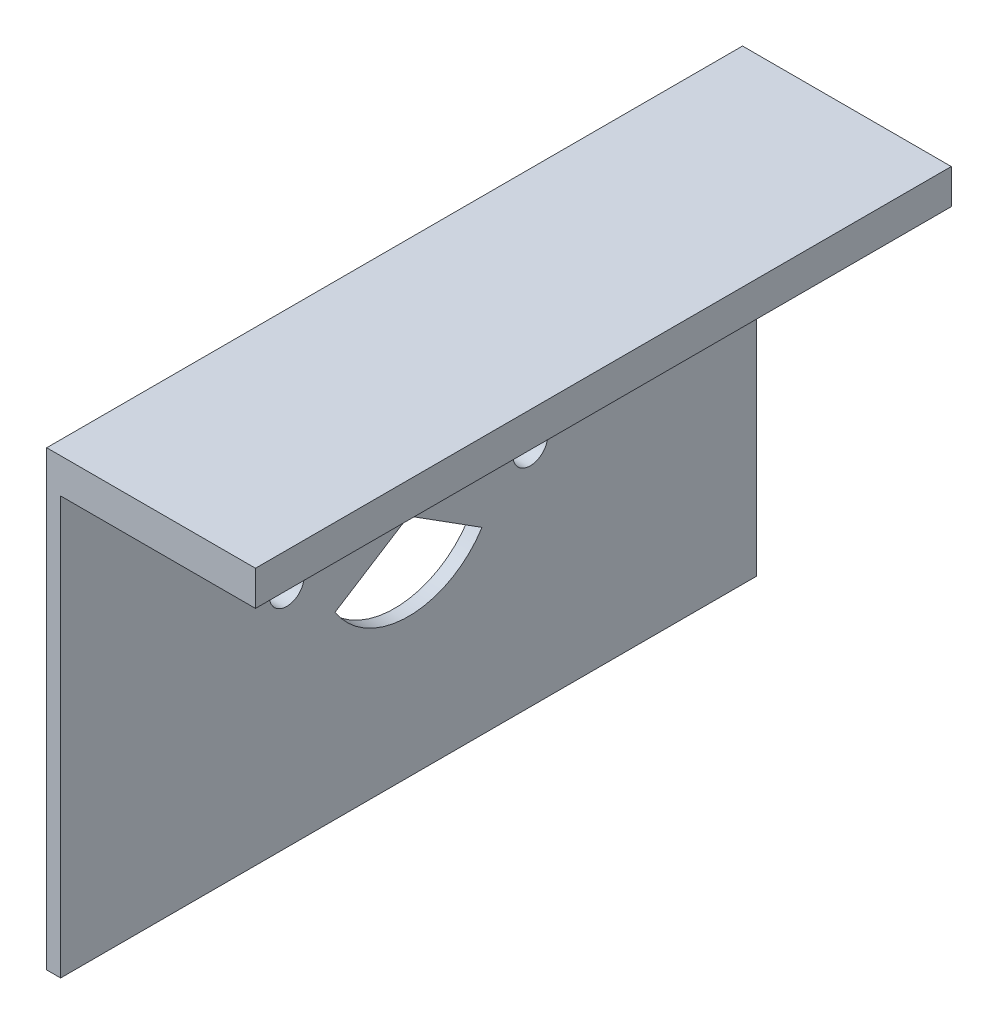
ISO-10303-21;
HEADER;
FILE_DESCRIPTION(('STEP AP214'),'2;1');
FILE_NAME('part.step','',(''),(''),'','','');
FILE_SCHEMA(('AUTOMOTIVE_DESIGN { 1 0 10303 214 1 1 1 1 }'));
ENDSEC;
DATA;
#1=APPLICATION_CONTEXT('core data for automotive mechanical design processes');
#2=APPLICATION_PROTOCOL_DEFINITION('international standard','automotive_design',2000,#1);
#3=PRODUCT_CONTEXT('',#1,'mechanical');
#4=PRODUCT('Part','Part','',(#3));
#5=PRODUCT_RELATED_PRODUCT_CATEGORY('part','',(#4));
#6=PRODUCT_DEFINITION_FORMATION('','',#4);
#7=PRODUCT_DEFINITION_CONTEXT('part definition',#1,'design');
#8=PRODUCT_DEFINITION('design','',#6,#7);
#9=PRODUCT_DEFINITION_SHAPE('','',#8);
#10=(LENGTH_UNIT() NAMED_UNIT(*) SI_UNIT(.MILLI.,.METRE.));
#11=(NAMED_UNIT(*) PLANE_ANGLE_UNIT() SI_UNIT($,.RADIAN.));
#12=(NAMED_UNIT(*) SI_UNIT($,.STERADIAN.) SOLID_ANGLE_UNIT());
#13=UNCERTAINTY_MEASURE_WITH_UNIT(LENGTH_MEASURE(1.E-05),#10,'distance_accuracy_value','');
#14=(GEOMETRIC_REPRESENTATION_CONTEXT(3) GLOBAL_UNCERTAINTY_ASSIGNED_CONTEXT((#13)) GLOBAL_UNIT_ASSIGNED_CONTEXT((#10,
#11,#12)) REPRESENTATION_CONTEXT('',''));
#15=CARTESIAN_POINT('',(0.,0.,0.));
#16=DIRECTION('',(0.,0.,1.));
#17=DIRECTION('',(1.,0.,0.));
#18=AXIS2_PLACEMENT_3D('',#15,#16,#17);
#19=CARTESIAN_POINT('',(2.,-32.5,0.));
#20=DIRECTION('',(0.,1.,0.));
#21=DIRECTION('',(0.,0.,1.));
#22=AXIS2_PLACEMENT_3D('',#19,#20,#21);
#23=PLANE('',#22);
#24=DIRECTION('',(0.,0.,-1.));
#25=VECTOR('',#24,1.);
#26=CARTESIAN_POINT('',(0.,-32.5,0.));
#27=LINE('',#26,#25);
#28=CARTESIAN_POINT('',(0.,-32.5,50.));
#29=VERTEX_POINT('',#28);
#30=CARTESIAN_POINT('',(0.,-32.5,-50.));
#31=VERTEX_POINT('',#30);
#32=EDGE_CURVE('E147',#29,#31,#27,.T.);
#33=ORIENTED_EDGE('',*,*,#32,.T.);
#34=DIRECTION('',(-1.,0.,0.));
#35=VECTOR('',#34,1.);
#36=CARTESIAN_POINT('',(2.,-32.5,-50.));
#37=LINE('',#36,#35);
#38=CARTESIAN_POINT('',(2.,-32.5,-50.));
#39=VERTEX_POINT('',#38);
#40=EDGE_CURVE('E11',#39,#31,#37,.T.);
#41=ORIENTED_EDGE('',*,*,#40,.F.);
#42=DIRECTION('',(0.,0.,-1.));
#43=VECTOR('',#42,1.);
#44=CARTESIAN_POINT('',(2.,-32.5,0.));
#45=LINE('',#44,#43);
#46=CARTESIAN_POINT('',(2.,-32.5,50.));
#47=VERTEX_POINT('',#46);
#48=EDGE_CURVE('E125',#47,#39,#45,.T.);
#49=ORIENTED_EDGE('',*,*,#48,.F.);
#50=DIRECTION('',(-1.,0.,0.));
#51=VECTOR('',#50,1.);
#52=CARTESIAN_POINT('',(2.,-32.5,50.));
#53=LINE('',#52,#51);
#54=EDGE_CURVE('E60',#47,#29,#53,.T.);
#55=ORIENTED_EDGE('',*,*,#54,.T.);
#56=EDGE_LOOP('',(#33,#41,#49,#55));
#57=FACE_BOUND('',#56,.T.);
#58=ADVANCED_FACE('F35',(#57),#23,.F.);
#59=CARTESIAN_POINT('',(2.,0.,-50.));
#60=DIRECTION('',(0.,0.,1.));
#61=DIRECTION('',(1.,0.,0.));
#62=AXIS2_PLACEMENT_3D('',#59,#60,#61);
#63=PLANE('',#62);
#64=DIRECTION('',(0.,1.,0.));
#65=VECTOR('',#64,1.);
#66=CARTESIAN_POINT('',(0.,0.,-50.));
#67=LINE('',#66,#65);
#68=CARTESIAN_POINT('',(0.,32.5,-50.));
#69=VERTEX_POINT('',#68);
#70=EDGE_CURVE('E149',#31,#69,#67,.T.);
#71=ORIENTED_EDGE('',*,*,#70,.T.);
#72=DIRECTION('',(-1.,0.,0.));
#73=VECTOR('',#72,1.);
#74=CARTESIAN_POINT('',(2.,32.5,-50.));
#75=LINE('',#74,#73);
#76=CARTESIAN_POINT('',(30.,32.5,-50.));
#77=VERTEX_POINT('',#76);
#78=EDGE_CURVE('E44',#77,#69,#75,.T.);
#79=ORIENTED_EDGE('',*,*,#78,.F.);
#80=DIRECTION('',(0.,1.,0.));
#81=VECTOR('',#80,1.);
#82=CARTESIAN_POINT('',(30.,27.5,-50.));
#83=LINE('',#82,#81);
#84=CARTESIAN_POINT('',(30.,27.5,-50.));
#85=VERTEX_POINT('',#84);
#86=EDGE_CURVE('E247',#85,#77,#83,.T.);
#87=ORIENTED_EDGE('',*,*,#86,.F.);
#88=DIRECTION('',(-1.,0.,0.));
#89=VECTOR('',#88,1.);
#90=CARTESIAN_POINT('',(30.,27.5,-50.));
#91=LINE('',#90,#89);
#92=CARTESIAN_POINT('',(2.,27.5,-50.));
#93=VERTEX_POINT('',#92);
#94=EDGE_CURVE('E240',#85,#93,#91,.T.);
#95=ORIENTED_EDGE('',*,*,#94,.T.);
#96=DIRECTION('',(0.,1.,0.));
#97=VECTOR('',#96,1.);
#98=CARTESIAN_POINT('',(2.,0.,-50.));
#99=LINE('',#98,#97);
#100=EDGE_CURVE('E128',#39,#93,#99,.T.);
#101=ORIENTED_EDGE('',*,*,#100,.F.);
#102=ORIENTED_EDGE('',*,*,#40,.T.);
#103=EDGE_LOOP('',(#71,#79,#87,#95,#101,#102));
#104=FACE_BOUND('',#103,.T.);
#105=ADVANCED_FACE('F193',(#104),#63,.F.);
#106=CARTESIAN_POINT('',(2.,32.5,0.));
#107=DIRECTION('',(0.,1.,0.));
#108=DIRECTION('',(0.,0.,1.));
#109=AXIS2_PLACEMENT_3D('',#106,#107,#108);
#110=PLANE('',#109);
#111=DIRECTION('',(0.,0.,-1.));
#112=VECTOR('',#111,1.);
#113=CARTESIAN_POINT('',(0.,32.5,0.));
#114=LINE('',#113,#112);
#115=CARTESIAN_POINT('',(0.,32.5,50.));
#116=VERTEX_POINT('',#115);
#117=EDGE_CURVE('E152',#116,#69,#114,.T.);
#118=ORIENTED_EDGE('',*,*,#117,.F.);
#119=DIRECTION('',(-1.,0.,0.));
#120=VECTOR('',#119,1.);
#121=CARTESIAN_POINT('',(2.,32.5,50.));
#122=LINE('',#121,#120);
#123=CARTESIAN_POINT('',(30.,32.5,50.));
#124=VERTEX_POINT('',#123);
#125=EDGE_CURVE('E164',#124,#116,#122,.T.);
#126=ORIENTED_EDGE('',*,*,#125,.F.);
#127=DIRECTION('',(0.,0.,1.));
#128=VECTOR('',#127,1.);
#129=CARTESIAN_POINT('',(30.,32.5,-50.));
#130=LINE('',#129,#128);
#131=EDGE_CURVE('E226',#77,#124,#130,.T.);
#132=ORIENTED_EDGE('',*,*,#131,.F.);
#133=ORIENTED_EDGE('',*,*,#78,.T.);
#134=EDGE_LOOP('',(#118,#126,#132,#133));
#135=FACE_BOUND('',#134,.T.);
#136=ADVANCED_FACE('F198',(#135),#110,.T.);
#137=CARTESIAN_POINT('',(2.,0.,0.));
#138=DIRECTION('',(0.,-0.844591752794364,-0.535410843289285));
#139=DIRECTION('',(0.,0.535410843289285,-0.844591752794364));
#140=AXIS2_PLACEMENT_3D('',#137,#138,#139);
#141=PLANE('',#140);
#142=DIRECTION('',(0.,-0.535410843289285,0.844591752794364));
#143=VECTOR('',#142,1.);
#144=CARTESIAN_POINT('',(0.,0.,0.));
#145=LINE('',#144,#143);
#146=CARTESIAN_POINT('',(0.,0.,0.));
#147=VERTEX_POINT('',#146);
#148=CARTESIAN_POINT('',(0.,-6.69263554111607,10.5573969099296));
#149=VERTEX_POINT('',#148);
#150=EDGE_CURVE('E140',#147,#149,#145,.T.);
#151=ORIENTED_EDGE('',*,*,#150,.F.);
#152=DIRECTION('',(-1.,0.,0.));
#153=VECTOR('',#152,1.);
#154=CARTESIAN_POINT('',(2.,0.,0.));
#155=LINE('',#154,#153);
#156=CARTESIAN_POINT('',(2.,0.,0.));
#157=VERTEX_POINT('',#156);
#158=EDGE_CURVE('E39',#157,#147,#155,.T.);
#159=ORIENTED_EDGE('',*,*,#158,.F.);
#160=DIRECTION('',(0.,-0.535410843289285,0.844591752794364));
#161=VECTOR('',#160,1.);
#162=CARTESIAN_POINT('',(2.,0.,0.));
#163=LINE('',#162,#161);
#164=CARTESIAN_POINT('',(2.,-6.69263554111607,10.5573969099296));
#165=VERTEX_POINT('',#164);
#166=EDGE_CURVE('E117',#157,#165,#163,.T.);
#167=ORIENTED_EDGE('',*,*,#166,.T.);
#168=DIRECTION('',(-1.,0.,0.));
#169=VECTOR('',#168,1.);
#170=CARTESIAN_POINT('',(2.,-6.69263554111607,10.5573969099296));
#171=LINE('',#170,#169);
#172=EDGE_CURVE('E106',#165,#149,#171,.T.);
#173=ORIENTED_EDGE('',*,*,#172,.T.);
#174=EDGE_LOOP('',(#151,#159,#167,#173));
#175=FACE_BOUND('',#174,.T.);
#176=ADVANCED_FACE('F37',(#175),#141,.T.);
#177=CARTESIAN_POINT('',(2.,0.,0.));
#178=DIRECTION('',(0.,0.844591752794364,-0.535410843289285));
#179=DIRECTION('',(0.,0.535410843289285,0.844591752794364));
#180=AXIS2_PLACEMENT_3D('',#177,#178,#179);
#181=PLANE('',#180);
#182=DIRECTION('',(0.,-0.535410843289285,-0.844591752794364));
#183=VECTOR('',#182,1.);
#184=CARTESIAN_POINT('',(0.,0.,0.));
#185=LINE('',#184,#183);
#186=CARTESIAN_POINT('',(0.,-6.69263554111607,-10.5573969099295));
#187=VERTEX_POINT('',#186);
#188=EDGE_CURVE('E142',#147,#187,#185,.T.);
#189=ORIENTED_EDGE('',*,*,#188,.T.);
#190=DIRECTION('',(-1.,0.,0.));
#191=VECTOR('',#190,1.);
#192=CARTESIAN_POINT('',(2.,-6.69263554111607,-10.5573969099295));
#193=LINE('',#192,#191);
#194=CARTESIAN_POINT('',(2.,-6.69263554111607,-10.5573969099295));
#195=VERTEX_POINT('',#194);
#196=EDGE_CURVE('E113',#195,#187,#193,.T.);
#197=ORIENTED_EDGE('',*,*,#196,.F.);
#198=DIRECTION('',(0.,-0.535410843289285,-0.844591752794364));
#199=VECTOR('',#198,1.);
#200=CARTESIAN_POINT('',(2.,0.,0.));
#201=LINE('',#200,#199);
#202=EDGE_CURVE('E119',#157,#195,#201,.T.);
#203=ORIENTED_EDGE('',*,*,#202,.F.);
#204=ORIENTED_EDGE('',*,*,#158,.T.);
#205=EDGE_LOOP('',(#189,#197,#203,#204));
#206=FACE_BOUND('',#205,.T.);
#207=ADVANCED_FACE('F168',(#206),#181,.F.);
#208=CARTESIAN_POINT('',(2.,0.,17.5));
#209=DIRECTION('',(-1.,0.,0.));
#210=DIRECTION('',(0.,0.,1.));
#211=AXIS2_PLACEMENT_3D('',#208,#209,#210);
#212=CYLINDRICAL_SURFACE('',#211,2.5);
#213=CARTESIAN_POINT('',(2.,0.,17.5));
#214=DIRECTION('',(1.,0.,0.));
#215=DIRECTION('',(0.,0.,-1.));
#216=AXIS2_PLACEMENT_3D('',#213,#214,#215);
#217=CIRCLE('',#216,2.5);
#218=CARTESIAN_POINT('',(2.,0.,15.));
#219=VERTEX_POINT('',#218);
#220=EDGE_CURVE('E135',#219,#219,#217,.T.);
#221=ORIENTED_EDGE('',*,*,#220,.T.);
#222=EDGE_LOOP('',(#221));
#223=FACE_BOUND('',#222,.T.);
#224=CARTESIAN_POINT('',(0.,0.,17.5));
#225=DIRECTION('',(1.,0.,0.));
#226=DIRECTION('',(0.,0.,-1.));
#227=AXIS2_PLACEMENT_3D('',#224,#225,#226);
#228=CIRCLE('',#227,2.5);
#229=CARTESIAN_POINT('',(0.,0.,15.));
#230=VERTEX_POINT('',#229);
#231=EDGE_CURVE('E158',#230,#230,#228,.T.);
#232=ORIENTED_EDGE('',*,*,#231,.F.);
#233=EDGE_LOOP('',(#232));
#234=FACE_BOUND('',#233,.T.);
#235=ADVANCED_FACE('F203',(#223,#234),#212,.F.);
#236=CARTESIAN_POINT('',(2.,0.,50.));
#237=DIRECTION('',(0.,0.,1.));
#238=DIRECTION('',(1.,0.,0.));
#239=AXIS2_PLACEMENT_3D('',#236,#237,#238);
#240=PLANE('',#239);
#241=DIRECTION('',(0.,1.,0.));
#242=VECTOR('',#241,1.);
#243=CARTESIAN_POINT('',(0.,0.,50.));
#244=LINE('',#243,#242);
#245=EDGE_CURVE('E155',#29,#116,#244,.T.);
#246=ORIENTED_EDGE('',*,*,#245,.F.);
#247=ORIENTED_EDGE('',*,*,#54,.F.);
#248=DIRECTION('',(0.,1.,0.));
#249=VECTOR('',#248,1.);
#250=CARTESIAN_POINT('',(2.,0.,50.));
#251=LINE('',#250,#249);
#252=CARTESIAN_POINT('',(2.,27.5,50.));
#253=VERTEX_POINT('',#252);
#254=EDGE_CURVE('E133',#47,#253,#251,.T.);
#255=ORIENTED_EDGE('',*,*,#254,.T.);
#256=DIRECTION('',(-1.,0.,0.));
#257=VECTOR('',#256,1.);
#258=CARTESIAN_POINT('',(30.,27.5,50.));
#259=LINE('',#258,#257);
#260=CARTESIAN_POINT('',(30.,27.5,50.));
#261=VERTEX_POINT('',#260);
#262=EDGE_CURVE('E143',#261,#253,#259,.T.);
#263=ORIENTED_EDGE('',*,*,#262,.F.);
#264=DIRECTION('',(0.,-1.,0.));
#265=VECTOR('',#264,1.);
#266=CARTESIAN_POINT('',(30.,32.5,50.));
#267=LINE('',#266,#265);
#268=EDGE_CURVE('E245',#124,#261,#267,.T.);
#269=ORIENTED_EDGE('',*,*,#268,.F.);
#270=ORIENTED_EDGE('',*,*,#125,.T.);
#271=EDGE_LOOP('',(#246,#247,#255,#263,#269,#270));
#272=FACE_BOUND('',#271,.T.);
#273=ADVANCED_FACE('F189',(#272),#240,.T.);
#274=CARTESIAN_POINT('',(2.,0.,0.));
#275=DIRECTION('',(-1.,0.,0.));
#276=DIRECTION('',(0.,0.,1.));
#277=AXIS2_PLACEMENT_3D('',#274,#275,#276);
#278=CYLINDRICAL_SURFACE('',#277,12.5);
#279=CARTESIAN_POINT('',(0.,0.,0.));
#280=DIRECTION('',(1.,0.,0.));
#281=DIRECTION('',(0.,0.,-1.));
#282=AXIS2_PLACEMENT_3D('',#279,#280,#281);
#283=CIRCLE('',#282,12.5);
#284=EDGE_CURVE('E111',#149,#187,#283,.T.);
#285=ORIENTED_EDGE('',*,*,#284,.F.);
#286=ORIENTED_EDGE('',*,*,#172,.F.);
#287=CARTESIAN_POINT('',(2.,0.,0.));
#288=DIRECTION('',(1.,0.,0.));
#289=DIRECTION('',(0.,0.,-1.));
#290=AXIS2_PLACEMENT_3D('',#287,#288,#289);
#291=CIRCLE('',#290,12.5);
#292=EDGE_CURVE('E109',#165,#195,#291,.T.);
#293=ORIENTED_EDGE('',*,*,#292,.T.);
#294=ORIENTED_EDGE('',*,*,#196,.T.);
#295=EDGE_LOOP('',(#285,#286,#293,#294));
#296=FACE_BOUND('',#295,.T.);
#297=ADVANCED_FACE('F107',(#296),#278,.F.);
#298=CARTESIAN_POINT('',(2.,0.,-17.5));
#299=DIRECTION('',(-1.,0.,0.));
#300=DIRECTION('',(0.,0.,1.));
#301=AXIS2_PLACEMENT_3D('',#298,#299,#300);
#302=CYLINDRICAL_SURFACE('',#301,2.5);
#303=CARTESIAN_POINT('',(2.,0.,-17.5));
#304=DIRECTION('',(1.,0.,0.));
#305=DIRECTION('',(0.,0.,-1.));
#306=AXIS2_PLACEMENT_3D('',#303,#304,#305);
#307=CIRCLE('',#306,2.5);
#308=CARTESIAN_POINT('',(2.,0.,-20.));
#309=VERTEX_POINT('',#308);
#310=EDGE_CURVE('E114',#309,#309,#307,.T.);
#311=ORIENTED_EDGE('',*,*,#310,.T.);
#312=EDGE_LOOP('',(#311));
#313=FACE_BOUND('',#312,.T.);
#314=CARTESIAN_POINT('',(0.,0.,-17.5));
#315=DIRECTION('',(1.,0.,0.));
#316=DIRECTION('',(0.,0.,-1.));
#317=AXIS2_PLACEMENT_3D('',#314,#315,#316);
#318=CIRCLE('',#317,2.5);
#319=CARTESIAN_POINT('',(0.,0.,-20.));
#320=VERTEX_POINT('',#319);
#321=EDGE_CURVE('E120',#320,#320,#318,.T.);
#322=ORIENTED_EDGE('',*,*,#321,.F.);
#323=EDGE_LOOP('',(#322));
#324=FACE_BOUND('',#323,.T.);
#325=ADVANCED_FACE('F180',(#313,#324),#302,.F.);
#326=CARTESIAN_POINT('',(2.,0.,0.));
#327=DIRECTION('',(1.,0.,0.));
#328=DIRECTION('',(0.,0.,-1.));
#329=AXIS2_PLACEMENT_3D('',#326,#327,#328);
#330=PLANE('',#329);
#331=DIRECTION('',(0.,0.,-1.));
#332=VECTOR('',#331,1.);
#333=CARTESIAN_POINT('',(2.,27.5,50.));
#334=LINE('',#333,#332);
#335=EDGE_CURVE('E52',#253,#93,#334,.T.);
#336=ORIENTED_EDGE('',*,*,#335,.F.);
#337=ORIENTED_EDGE('',*,*,#254,.F.);
#338=ORIENTED_EDGE('',*,*,#48,.T.);
#339=ORIENTED_EDGE('',*,*,#100,.T.);
#340=EDGE_LOOP('',(#336,#337,#338,#339));
#341=FACE_BOUND('',#340,.T.);
#342=ORIENTED_EDGE('',*,*,#166,.F.);
#343=ORIENTED_EDGE('',*,*,#202,.T.);
#344=ORIENTED_EDGE('',*,*,#292,.F.);
#345=EDGE_LOOP('',(#342,#343,#344));
#346=FACE_BOUND('',#345,.T.);
#347=ORIENTED_EDGE('',*,*,#220,.F.);
#348=EDGE_LOOP('',(#347));
#349=FACE_BOUND('',#348,.T.);
#350=ORIENTED_EDGE('',*,*,#310,.F.);
#351=EDGE_LOOP('',(#350));
#352=FACE_BOUND('',#351,.T.);
#353=ADVANCED_FACE('F122',(#341,#346,#349,#352),#330,.T.);
#354=CARTESIAN_POINT('',(0.,0.,0.));
#355=DIRECTION('',(1.,0.,0.));
#356=DIRECTION('',(0.,0.,-1.));
#357=AXIS2_PLACEMENT_3D('',#354,#355,#356);
#358=PLANE('',#357);
#359=ORIENTED_EDGE('',*,*,#150,.T.);
#360=ORIENTED_EDGE('',*,*,#284,.T.);
#361=ORIENTED_EDGE('',*,*,#188,.F.);
#362=EDGE_LOOP('',(#359,#360,#361));
#363=FACE_BOUND('',#362,.T.);
#364=ORIENTED_EDGE('',*,*,#32,.F.);
#365=ORIENTED_EDGE('',*,*,#245,.T.);
#366=ORIENTED_EDGE('',*,*,#117,.T.);
#367=ORIENTED_EDGE('',*,*,#70,.F.);
#368=EDGE_LOOP('',(#364,#365,#366,#367));
#369=FACE_BOUND('',#368,.T.);
#370=ORIENTED_EDGE('',*,*,#231,.T.);
#371=EDGE_LOOP('',(#370));
#372=FACE_BOUND('',#371,.T.);
#373=ORIENTED_EDGE('',*,*,#321,.T.);
#374=EDGE_LOOP('',(#373));
#375=FACE_BOUND('',#374,.T.);
#376=ADVANCED_FACE('F170',(#363,#369,#372,#375),#358,.F.);
#377=CARTESIAN_POINT('',(30.,27.5,50.));
#378=DIRECTION('',(0.,1.,0.));
#379=DIRECTION('',(0.,0.,1.));
#380=AXIS2_PLACEMENT_3D('',#377,#378,#379);
#381=PLANE('',#380);
#382=ORIENTED_EDGE('',*,*,#335,.T.);
#383=ORIENTED_EDGE('',*,*,#94,.F.);
#384=DIRECTION('',(0.,0.,-1.));
#385=VECTOR('',#384,1.);
#386=CARTESIAN_POINT('',(30.,27.5,50.));
#387=LINE('',#386,#385);
#388=EDGE_CURVE('E238',#261,#85,#387,.T.);
#389=ORIENTED_EDGE('',*,*,#388,.F.);
#390=ORIENTED_EDGE('',*,*,#262,.T.);
#391=EDGE_LOOP('',(#382,#383,#389,#390));
#392=FACE_BOUND('',#391,.T.);
#393=ADVANCED_FACE('F173',(#392),#381,.F.);
#394=CARTESIAN_POINT('',(30.,0.,0.));
#395=DIRECTION('',(1.,0.,0.));
#396=DIRECTION('',(0.,0.,-1.));
#397=AXIS2_PLACEMENT_3D('',#394,#395,#396);
#398=PLANE('',#397);
#399=ORIENTED_EDGE('',*,*,#268,.T.);
#400=ORIENTED_EDGE('',*,*,#388,.T.);
#401=ORIENTED_EDGE('',*,*,#86,.T.);
#402=ORIENTED_EDGE('',*,*,#131,.T.);
#403=EDGE_LOOP('',(#399,#400,#401,#402));
#404=FACE_BOUND('',#403,.T.);
#405=ADVANCED_FACE('F251',(#404),#398,.T.);
#406=CLOSED_SHELL('',(#58,#105,#136,#176,#207,#235,#273,#297,#325,#353,#376,#393,#405));
#407=MANIFOLD_SOLID_BREP('B2',#406);
#408=ADVANCED_BREP_SHAPE_REPRESENTATION('',(#18,#407),#14);
#409=SHAPE_DEFINITION_REPRESENTATION(#9,#408);
ENDSEC;
END-ISO-10303-21;
